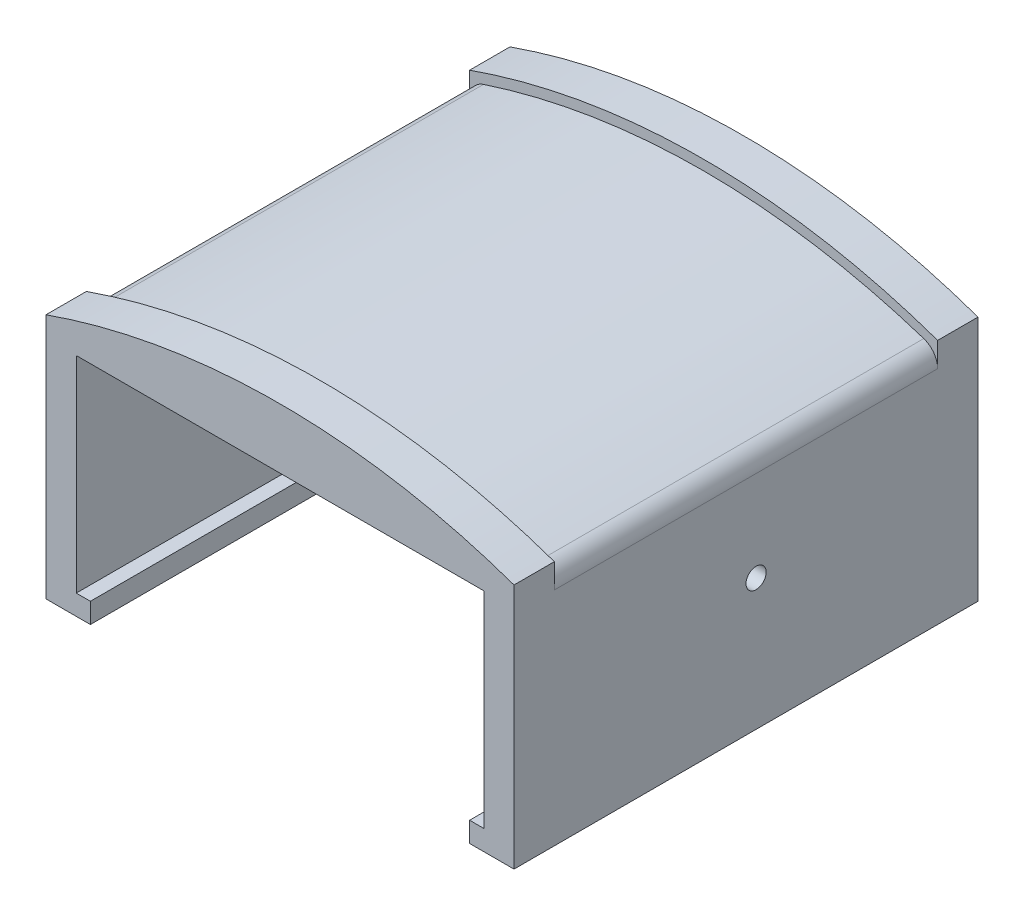
ISO-10303-21;
HEADER;
FILE_DESCRIPTION(('STEP AP214'),'2;1');
FILE_NAME('part.step','',(''),(''),'','','');
FILE_SCHEMA(('AUTOMOTIVE_DESIGN { 1 0 10303 214 1 1 1 1 }'));
ENDSEC;
DATA;
#1=APPLICATION_CONTEXT('core data for automotive mechanical design processes');
#2=APPLICATION_PROTOCOL_DEFINITION('international standard','automotive_design',2000,#1);
#3=PRODUCT_CONTEXT('',#1,'mechanical');
#4=PRODUCT('Part','Part','',(#3));
#5=PRODUCT_RELATED_PRODUCT_CATEGORY('part','',(#4));
#6=PRODUCT_DEFINITION_FORMATION('','',#4);
#7=PRODUCT_DEFINITION_CONTEXT('part definition',#1,'design');
#8=PRODUCT_DEFINITION('design','',#6,#7);
#9=PRODUCT_DEFINITION_SHAPE('','',#8);
#10=(LENGTH_UNIT() NAMED_UNIT(*) SI_UNIT(.MILLI.,.METRE.));
#11=(NAMED_UNIT(*) PLANE_ANGLE_UNIT() SI_UNIT($,.RADIAN.));
#12=(NAMED_UNIT(*) SI_UNIT($,.STERADIAN.) SOLID_ANGLE_UNIT());
#13=UNCERTAINTY_MEASURE_WITH_UNIT(LENGTH_MEASURE(1.E-05),#10,'distance_accuracy_value','');
#14=(GEOMETRIC_REPRESENTATION_CONTEXT(3) GLOBAL_UNCERTAINTY_ASSIGNED_CONTEXT((#13)) GLOBAL_UNIT_ASSIGNED_CONTEXT((#10,
#11,#12)) REPRESENTATION_CONTEXT('',''));
#15=CARTESIAN_POINT('',(0.,0.,0.));
#16=DIRECTION('',(0.,0.,1.));
#17=DIRECTION('',(1.,0.,0.));
#18=AXIS2_PLACEMENT_3D('',#15,#16,#17);
#19=CARTESIAN_POINT('',(0.,-82.6053998738605,25.4));
#20=DIRECTION('',(0.,0.,-1.));
#21=DIRECTION('',(-1.,0.,0.));
#22=AXIS2_PLACEMENT_3D('',#19,#20,#21);
#23=CYLINDRICAL_SURFACE('',#22,88.9);
#24=CARTESIAN_POINT('',(0.,-82.6053998738605,25.4));
#25=DIRECTION('',(0.,0.,1.));
#26=DIRECTION('',(-1.,0.,0.));
#27=AXIS2_PLACEMENT_3D('',#24,#25,#26);
#28=CIRCLE('',#27,88.9);
#29=CARTESIAN_POINT('',(27.7158823529412,1.86376530135549,25.4));
#30=VERTEX_POINT('',#29);
#31=CARTESIAN_POINT('',(-27.7158823529412,1.86376530135549,25.4));
#32=VERTEX_POINT('',#31);
#33=EDGE_CURVE('E267',#30,#32,#28,.T.);
#34=ORIENTED_EDGE('',*,*,#33,.F.);
#35=DIRECTION('',(0.,0.,-1.));
#36=VECTOR('',#35,1.);
#37=CARTESIAN_POINT('',(27.7158823529412,1.8637653013555,25.4));
#38=LINE('',#37,#36);
#39=CARTESIAN_POINT('',(27.7158823529412,1.86376530135549,-22.86));
#40=VERTEX_POINT('',#39);
#41=EDGE_CURVE('E292',#30,#40,#38,.T.);
#42=ORIENTED_EDGE('',*,*,#41,.T.);
#43=CARTESIAN_POINT('',(0.,-82.6053998738605,-22.86));
#44=DIRECTION('',(0.,0.,-1.));
#45=DIRECTION('',(-1.,0.,0.));
#46=AXIS2_PLACEMENT_3D('',#43,#44,#45);
#47=CIRCLE('',#46,88.9);
#48=CARTESIAN_POINT('',(-27.7158823529412,1.86376530135549,-22.86));
#49=VERTEX_POINT('',#48);
#50=EDGE_CURVE('E179',#49,#40,#47,.T.);
#51=ORIENTED_EDGE('',*,*,#50,.F.);
#52=DIRECTION('',(0.,0.,-1.));
#53=VECTOR('',#52,1.);
#54=CARTESIAN_POINT('',(-27.7158823529412,1.8637653013555,25.4));
#55=LINE('',#54,#53);
#56=EDGE_CURVE('E290',#49,#32,#55,.F.);
#57=ORIENTED_EDGE('',*,*,#56,.T.);
#58=EDGE_LOOP('',(#34,#42,#51,#57));
#59=FACE_BOUND('',#58,.T.);
#60=ADVANCED_FACE('F35',(#59),#23,.T.);
#61=CARTESIAN_POINT('',(-25.654,0.,25.4));
#62=DIRECTION('',(-1.,0.,0.));
#63=DIRECTION('',(0.,-1.,0.));
#64=AXIS2_PLACEMENT_3D('',#61,#62,#63);
#65=PLANE('',#64);
#66=CARTESIAN_POINT('',(-25.654,-11.938,0.));
#67=DIRECTION('',(-1.,0.,0.));
#68=DIRECTION('',(0.,-1.,0.));
#69=AXIS2_PLACEMENT_3D('',#66,#67,#68);
#70=CIRCLE('',#69,1.27);
#71=CARTESIAN_POINT('',(-25.654,-13.208,0.));
#72=VERTEX_POINT('',#71);
#73=EDGE_CURVE('E192',#72,#72,#70,.T.);
#74=ORIENTED_EDGE('',*,*,#73,.T.);
#75=EDGE_LOOP('',(#74));
#76=FACE_BOUND('',#75,.T.);
#77=DIRECTION('',(0.,1.,0.));
#78=VECTOR('',#77,1.);
#79=CARTESIAN_POINT('',(-25.654,-25.908,-27.94));
#80=LINE('',#79,#78);
#81=CARTESIAN_POINT('',(-25.654,-25.908,-27.94));
#82=VERTEX_POINT('',#81);
#83=CARTESIAN_POINT('',(-25.654,0.,-27.94));
#84=VERTEX_POINT('',#83);
#85=EDGE_CURVE('E191',#82,#84,#80,.T.);
#86=ORIENTED_EDGE('',*,*,#85,.T.);
#87=DIRECTION('',(0.,0.,-1.));
#88=VECTOR('',#87,1.);
#89=CARTESIAN_POINT('',(-25.654,0.,25.4));
#90=LINE('',#89,#88);
#91=CARTESIAN_POINT('',(-25.654,0.,30.48));
#92=VERTEX_POINT('',#91);
#93=EDGE_CURVE('E288',#92,#84,#90,.T.);
#94=ORIENTED_EDGE('',*,*,#93,.F.);
#95=DIRECTION('',(0.,1.,0.));
#96=VECTOR('',#95,1.);
#97=CARTESIAN_POINT('',(-25.654,-25.908,30.48));
#98=LINE('',#97,#96);
#99=CARTESIAN_POINT('',(-25.654,-25.908,30.48));
#100=VERTEX_POINT('',#99);
#101=EDGE_CURVE('E227',#100,#92,#98,.T.);
#102=ORIENTED_EDGE('',*,*,#101,.F.);
#103=DIRECTION('',(0.,0.,-1.));
#104=VECTOR('',#103,1.);
#105=CARTESIAN_POINT('',(-25.654,-25.908,25.4));
#106=LINE('',#105,#104);
#107=EDGE_CURVE('E270',#100,#82,#106,.T.);
#108=ORIENTED_EDGE('',*,*,#107,.T.);
#109=EDGE_LOOP('',(#86,#94,#102,#108));
#110=FACE_BOUND('',#109,.T.);
#111=ADVANCED_FACE('F363',(#76,#110),#65,.F.);
#112=CARTESIAN_POINT('',(-25.654,0.,25.4));
#113=DIRECTION('',(0.,1.,0.));
#114=DIRECTION('',(-1.,0.,0.));
#115=AXIS2_PLACEMENT_3D('',#112,#113,#114);
#116=PLANE('',#115);
#117=DIRECTION('',(1.,0.,0.));
#118=VECTOR('',#117,1.);
#119=CARTESIAN_POINT('',(-25.654,0.,-27.94));
#120=LINE('',#119,#118);
#121=CARTESIAN_POINT('',(25.654,0.,-27.94));
#122=VERTEX_POINT('',#121);
#123=EDGE_CURVE('E195',#84,#122,#120,.T.);
#124=ORIENTED_EDGE('',*,*,#123,.T.);
#125=DIRECTION('',(0.,0.,-1.));
#126=VECTOR('',#125,1.);
#127=CARTESIAN_POINT('',(25.654,0.,25.4));
#128=LINE('',#127,#126);
#129=CARTESIAN_POINT('',(25.654,0.,30.48));
#130=VERTEX_POINT('',#129);
#131=EDGE_CURVE('E286',#130,#122,#128,.T.);
#132=ORIENTED_EDGE('',*,*,#131,.F.);
#133=DIRECTION('',(1.,0.,0.));
#134=VECTOR('',#133,1.);
#135=CARTESIAN_POINT('',(-25.654,0.,30.48));
#136=LINE('',#135,#134);
#137=EDGE_CURVE('E230',#92,#130,#136,.T.);
#138=ORIENTED_EDGE('',*,*,#137,.F.);
#139=ORIENTED_EDGE('',*,*,#93,.T.);
#140=EDGE_LOOP('',(#124,#132,#138,#139));
#141=FACE_BOUND('',#140,.T.);
#142=ADVANCED_FACE('F350',(#141),#116,.F.);
#143=CARTESIAN_POINT('',(25.654,0.,25.4));
#144=DIRECTION('',(1.,0.,0.));
#145=DIRECTION('',(0.,1.,0.));
#146=AXIS2_PLACEMENT_3D('',#143,#144,#145);
#147=PLANE('',#146);
#148=CARTESIAN_POINT('',(25.654,-11.938,0.));
#149=DIRECTION('',(1.,0.,0.));
#150=DIRECTION('',(0.,1.,0.));
#151=AXIS2_PLACEMENT_3D('',#148,#149,#150);
#152=CIRCLE('',#151,1.27);
#153=CARTESIAN_POINT('',(25.654,-10.668,0.));
#154=VERTEX_POINT('',#153);
#155=EDGE_CURVE('E418',#154,#154,#152,.T.);
#156=ORIENTED_EDGE('',*,*,#155,.T.);
#157=EDGE_LOOP('',(#156));
#158=FACE_BOUND('',#157,.T.);
#159=DIRECTION('',(0.,-1.,0.));
#160=VECTOR('',#159,1.);
#161=CARTESIAN_POINT('',(25.654,0.,-27.94));
#162=LINE('',#161,#160);
#163=CARTESIAN_POINT('',(25.654,-25.908,-27.94));
#164=VERTEX_POINT('',#163);
#165=EDGE_CURVE('E198',#122,#164,#162,.T.);
#166=ORIENTED_EDGE('',*,*,#165,.T.);
#167=DIRECTION('',(0.,0.,-1.));
#168=VECTOR('',#167,1.);
#169=CARTESIAN_POINT('',(25.654,-25.908,25.4));
#170=LINE('',#169,#168);
#171=CARTESIAN_POINT('',(25.654,-25.908,30.48));
#172=VERTEX_POINT('',#171);
#173=EDGE_CURVE('E284',#172,#164,#170,.T.);
#174=ORIENTED_EDGE('',*,*,#173,.F.);
#175=DIRECTION('',(0.,-1.,0.));
#176=VECTOR('',#175,1.);
#177=CARTESIAN_POINT('',(25.654,0.,30.48));
#178=LINE('',#177,#176);
#179=EDGE_CURVE('E233',#130,#172,#178,.T.);
#180=ORIENTED_EDGE('',*,*,#179,.F.);
#181=ORIENTED_EDGE('',*,*,#131,.T.);
#182=EDGE_LOOP('',(#166,#174,#180,#181));
#183=FACE_BOUND('',#182,.T.);
#184=ADVANCED_FACE('F354',(#158,#183),#147,.F.);
#185=CARTESIAN_POINT('',(25.654,-25.908,25.4));
#186=DIRECTION('',(0.,-1.,0.));
#187=DIRECTION('',(0.,0.,-1.));
#188=AXIS2_PLACEMENT_3D('',#185,#186,#187);
#189=PLANE('',#188);
#190=DIRECTION('',(-1.,0.,0.));
#191=VECTOR('',#190,1.);
#192=CARTESIAN_POINT('',(25.654,-25.908,-27.94));
#193=LINE('',#192,#191);
#194=CARTESIAN_POINT('',(23.876,-25.908,-27.94));
#195=VERTEX_POINT('',#194);
#196=EDGE_CURVE('E201',#164,#195,#193,.T.);
#197=ORIENTED_EDGE('',*,*,#196,.T.);
#198=DIRECTION('',(0.,0.,-1.));
#199=VECTOR('',#198,1.);
#200=CARTESIAN_POINT('',(23.876,-25.908,25.4));
#201=LINE('',#200,#199);
#202=CARTESIAN_POINT('',(23.876,-25.908,30.48));
#203=VERTEX_POINT('',#202);
#204=EDGE_CURVE('E282',#203,#195,#201,.T.);
#205=ORIENTED_EDGE('',*,*,#204,.F.);
#206=DIRECTION('',(-1.,0.,0.));
#207=VECTOR('',#206,1.);
#208=CARTESIAN_POINT('',(25.654,-25.908,30.48));
#209=LINE('',#208,#207);
#210=EDGE_CURVE('E236',#172,#203,#209,.T.);
#211=ORIENTED_EDGE('',*,*,#210,.F.);
#212=ORIENTED_EDGE('',*,*,#173,.T.);
#213=EDGE_LOOP('',(#197,#205,#211,#212));
#214=FACE_BOUND('',#213,.T.);
#215=ADVANCED_FACE('F359',(#214),#189,.F.);
#216=CARTESIAN_POINT('',(23.876,-25.908,25.4));
#217=DIRECTION('',(1.,0.,0.));
#218=DIRECTION('',(0.,0.,-1.));
#219=AXIS2_PLACEMENT_3D('',#216,#217,#218);
#220=PLANE('',#219);
#221=DIRECTION('',(0.,-1.,0.));
#222=VECTOR('',#221,1.);
#223=CARTESIAN_POINT('',(23.876,-25.908,-27.94));
#224=LINE('',#223,#222);
#225=CARTESIAN_POINT('',(23.876,-28.448,-27.94));
#226=VERTEX_POINT('',#225);
#227=EDGE_CURVE('E204',#195,#226,#224,.T.);
#228=ORIENTED_EDGE('',*,*,#227,.T.);
#229=DIRECTION('',(0.,0.,-1.));
#230=VECTOR('',#229,1.);
#231=CARTESIAN_POINT('',(23.876,-28.448,25.4));
#232=LINE('',#231,#230);
#233=CARTESIAN_POINT('',(23.876,-28.448,30.48));
#234=VERTEX_POINT('',#233);
#235=EDGE_CURVE('E280',#234,#226,#232,.T.);
#236=ORIENTED_EDGE('',*,*,#235,.F.);
#237=DIRECTION('',(0.,-1.,0.));
#238=VECTOR('',#237,1.);
#239=CARTESIAN_POINT('',(23.876,-25.908,30.48));
#240=LINE('',#239,#238);
#241=EDGE_CURVE('E239',#203,#234,#240,.T.);
#242=ORIENTED_EDGE('',*,*,#241,.F.);
#243=ORIENTED_EDGE('',*,*,#204,.T.);
#244=EDGE_LOOP('',(#228,#236,#242,#243));
#245=FACE_BOUND('',#244,.T.);
#246=ADVANCED_FACE('F361',(#245),#220,.F.);
#247=CARTESIAN_POINT('',(23.876,-28.448,25.4));
#248=DIRECTION('',(0.,1.,0.));
#249=DIRECTION('',(-1.,0.,0.));
#250=AXIS2_PLACEMENT_3D('',#247,#248,#249);
#251=PLANE('',#250);
#252=DIRECTION('',(1.,0.,0.));
#253=VECTOR('',#252,1.);
#254=CARTESIAN_POINT('',(23.876,-28.448,-27.94));
#255=LINE('',#254,#253);
#256=CARTESIAN_POINT('',(29.464,-28.448,-27.94));
#257=VERTEX_POINT('',#256);
#258=EDGE_CURVE('E207',#226,#257,#255,.T.);
#259=ORIENTED_EDGE('',*,*,#258,.T.);
#260=DIRECTION('',(0.,0.,-1.));
#261=VECTOR('',#260,1.);
#262=CARTESIAN_POINT('',(29.464,-28.448,25.4));
#263=LINE('',#262,#261);
#264=CARTESIAN_POINT('',(29.464,-28.448,30.48));
#265=VERTEX_POINT('',#264);
#266=EDGE_CURVE('E278',#265,#257,#263,.T.);
#267=ORIENTED_EDGE('',*,*,#266,.F.);
#268=DIRECTION('',(1.,0.,0.));
#269=VECTOR('',#268,1.);
#270=CARTESIAN_POINT('',(23.876,-28.448,30.48));
#271=LINE('',#270,#269);
#272=EDGE_CURVE('E242',#234,#265,#271,.T.);
#273=ORIENTED_EDGE('',*,*,#272,.F.);
#274=ORIENTED_EDGE('',*,*,#235,.T.);
#275=EDGE_LOOP('',(#259,#267,#273,#274));
#276=FACE_BOUND('',#275,.T.);
#277=ADVANCED_FACE('F328',(#276),#251,.F.);
#278=CARTESIAN_POINT('',(29.464,-28.448,25.4));
#279=DIRECTION('',(-1.,0.,0.));
#280=DIRECTION('',(0.,-1.,0.));
#281=AXIS2_PLACEMENT_3D('',#278,#279,#280);
#282=PLANE('',#281);
#283=CARTESIAN_POINT('',(29.464,-11.938,0.));
#284=DIRECTION('',(-1.,0.,0.));
#285=DIRECTION('',(0.,0.,1.));
#286=AXIS2_PLACEMENT_3D('',#283,#284,#285);
#287=CIRCLE('',#286,1.27);
#288=CARTESIAN_POINT('',(29.464,-11.938,1.27));
#289=VERTEX_POINT('',#288);
#290=EDGE_CURVE('E420',#289,#289,#287,.T.);
#291=ORIENTED_EDGE('',*,*,#290,.T.);
#292=EDGE_LOOP('',(#291));
#293=FACE_BOUND('',#292,.T.);
#294=DIRECTION('',(0.,1.,0.));
#295=VECTOR('',#294,1.);
#296=CARTESIAN_POINT('',(29.464,-28.448,-22.86));
#297=LINE('',#296,#295);
#298=CARTESIAN_POINT('',(29.464,-0.549639417936399,-22.86));
#299=VERTEX_POINT('',#298);
#300=CARTESIAN_POINT('',(29.464,2.54,-22.86));
#301=VERTEX_POINT('',#300);
#302=EDGE_CURVE('E159',#299,#301,#297,.T.);
#303=ORIENTED_EDGE('',*,*,#302,.F.);
#304=DIRECTION('',(0.,0.,-1.));
#305=VECTOR('',#304,1.);
#306=CARTESIAN_POINT('',(29.464,-0.549639417936398,25.4));
#307=LINE('',#306,#305);
#308=CARTESIAN_POINT('',(29.464,-0.549639417936405,25.4));
#309=VERTEX_POINT('',#308);
#310=EDGE_CURVE('E295',#299,#309,#307,.F.);
#311=ORIENTED_EDGE('',*,*,#310,.T.);
#312=DIRECTION('',(0.,1.,0.));
#313=VECTOR('',#312,1.);
#314=CARTESIAN_POINT('',(29.464,-28.448,25.4));
#315=LINE('',#314,#313);
#316=CARTESIAN_POINT('',(29.464,2.54,25.4));
#317=VERTEX_POINT('',#316);
#318=EDGE_CURVE('E223',#309,#317,#315,.T.);
#319=ORIENTED_EDGE('',*,*,#318,.T.);
#320=DIRECTION('',(0.,0.,-1.));
#321=VECTOR('',#320,1.);
#322=CARTESIAN_POINT('',(29.464,2.54,30.48));
#323=LINE('',#322,#321);
#324=CARTESIAN_POINT('',(29.464,2.54,30.48));
#325=VERTEX_POINT('',#324);
#326=EDGE_CURVE('E264',#325,#317,#323,.T.);
#327=ORIENTED_EDGE('',*,*,#326,.F.);
#328=DIRECTION('',(0.,1.,0.));
#329=VECTOR('',#328,1.);
#330=CARTESIAN_POINT('',(29.464,-28.448,30.48));
#331=LINE('',#330,#329);
#332=EDGE_CURVE('E245',#265,#325,#331,.T.);
#333=ORIENTED_EDGE('',*,*,#332,.F.);
#334=ORIENTED_EDGE('',*,*,#266,.T.);
#335=DIRECTION('',(0.,1.,0.));
#336=VECTOR('',#335,1.);
#337=CARTESIAN_POINT('',(29.464,-28.448,-27.94));
#338=LINE('',#337,#336);
#339=CARTESIAN_POINT('',(29.464,2.54,-27.94));
#340=VERTEX_POINT('',#339);
#341=EDGE_CURVE('E176',#257,#340,#338,.T.);
#342=ORIENTED_EDGE('',*,*,#341,.T.);
#343=DIRECTION('',(0.,0.,-1.));
#344=VECTOR('',#343,1.);
#345=CARTESIAN_POINT('',(29.464,2.54,-22.86));
#346=LINE('',#345,#344);
#347=EDGE_CURVE('E173',#301,#340,#346,.T.);
#348=ORIENTED_EDGE('',*,*,#347,.F.);
#349=EDGE_LOOP('',(#303,#311,#319,#327,#333,#334,#342,#348));
#350=FACE_BOUND('',#349,.T.);
#351=ADVANCED_FACE('F174',(#293,#350),#282,.F.);
#352=CARTESIAN_POINT('',(-29.464,-28.448,25.4));
#353=DIRECTION('',(1.,0.,0.));
#354=DIRECTION('',(0.,0.,-1.));
#355=AXIS2_PLACEMENT_3D('',#352,#353,#354);
#356=PLANE('',#355);
#357=CARTESIAN_POINT('',(-29.464,-11.938,0.));
#358=DIRECTION('',(-1.,0.,0.));
#359=DIRECTION('',(0.,0.,1.));
#360=AXIS2_PLACEMENT_3D('',#357,#358,#359);
#361=CIRCLE('',#360,1.27);
#362=CARTESIAN_POINT('',(-29.464,-11.938,1.27));
#363=VERTEX_POINT('',#362);
#364=EDGE_CURVE('E423',#363,#363,#361,.T.);
#365=ORIENTED_EDGE('',*,*,#364,.F.);
#366=EDGE_LOOP('',(#365));
#367=FACE_BOUND('',#366,.T.);
#368=DIRECTION('',(0.,0.,-1.));
#369=VECTOR('',#368,1.);
#370=CARTESIAN_POINT('',(-29.464,-0.549639417936398,25.4));
#371=LINE('',#370,#369);
#372=CARTESIAN_POINT('',(-29.464,-0.549639417936405,25.4));
#373=VERTEX_POINT('',#372);
#374=CARTESIAN_POINT('',(-29.464,-0.549639417936398,-22.86));
#375=VERTEX_POINT('',#374);
#376=EDGE_CURVE('E297',#373,#375,#371,.T.);
#377=ORIENTED_EDGE('',*,*,#376,.T.);
#378=DIRECTION('',(0.,-1.,0.));
#379=VECTOR('',#378,1.);
#380=CARTESIAN_POINT('',(-29.464,-28.448,-22.86));
#381=LINE('',#380,#379);
#382=CARTESIAN_POINT('',(-29.464,2.53999999999999,-22.86));
#383=VERTEX_POINT('',#382);
#384=EDGE_CURVE('E50',#383,#375,#381,.T.);
#385=ORIENTED_EDGE('',*,*,#384,.F.);
#386=DIRECTION('',(0.,0.,-1.));
#387=VECTOR('',#386,1.);
#388=CARTESIAN_POINT('',(-29.464,2.53999999999999,-22.86));
#389=LINE('',#388,#387);
#390=CARTESIAN_POINT('',(-29.464,2.53999999999999,-27.94));
#391=VERTEX_POINT('',#390);
#392=EDGE_CURVE('E180',#383,#391,#389,.T.);
#393=ORIENTED_EDGE('',*,*,#392,.T.);
#394=DIRECTION('',(0.,-1.,0.));
#395=VECTOR('',#394,1.);
#396=CARTESIAN_POINT('',(-29.464,-28.448,-27.94));
#397=LINE('',#396,#395);
#398=CARTESIAN_POINT('',(-29.464,-28.448,-27.94));
#399=VERTEX_POINT('',#398);
#400=EDGE_CURVE('E213',#391,#399,#397,.T.);
#401=ORIENTED_EDGE('',*,*,#400,.T.);
#402=DIRECTION('',(0.,0.,-1.));
#403=VECTOR('',#402,1.);
#404=CARTESIAN_POINT('',(-29.464,-28.448,25.4));
#405=LINE('',#404,#403);
#406=CARTESIAN_POINT('',(-29.464,-28.448,30.48));
#407=VERTEX_POINT('',#406);
#408=EDGE_CURVE('E276',#407,#399,#405,.T.);
#409=ORIENTED_EDGE('',*,*,#408,.F.);
#410=DIRECTION('',(0.,-1.,0.));
#411=VECTOR('',#410,1.);
#412=CARTESIAN_POINT('',(-29.464,-28.448,30.48));
#413=LINE('',#412,#411);
#414=CARTESIAN_POINT('',(-29.464,2.53999999999999,30.48));
#415=VERTEX_POINT('',#414);
#416=EDGE_CURVE('E249',#415,#407,#413,.T.);
#417=ORIENTED_EDGE('',*,*,#416,.F.);
#418=DIRECTION('',(0.,0.,-1.));
#419=VECTOR('',#418,1.);
#420=CARTESIAN_POINT('',(-29.464,2.53999999999999,30.48));
#421=LINE('',#420,#419);
#422=CARTESIAN_POINT('',(-29.464,2.53999999999999,25.4));
#423=VERTEX_POINT('',#422);
#424=EDGE_CURVE('E258',#415,#423,#421,.T.);
#425=ORIENTED_EDGE('',*,*,#424,.T.);
#426=DIRECTION('',(0.,-1.,0.));
#427=VECTOR('',#426,1.);
#428=CARTESIAN_POINT('',(-29.464,-28.448,25.4));
#429=LINE('',#428,#427);
#430=EDGE_CURVE('E58',#423,#373,#429,.T.);
#431=ORIENTED_EDGE('',*,*,#430,.T.);
#432=EDGE_LOOP('',(#377,#385,#393,#401,#409,#417,#425,#431));
#433=FACE_BOUND('',#432,.T.);
#434=ADVANCED_FACE('F335',(#367,#433),#356,.F.);
#435=CARTESIAN_POINT('',(-23.876,-28.448,25.4));
#436=DIRECTION('',(0.,1.,0.));
#437=DIRECTION('',(0.,0.,1.));
#438=AXIS2_PLACEMENT_3D('',#435,#436,#437);
#439=PLANE('',#438);
#440=DIRECTION('',(1.,0.,0.));
#441=VECTOR('',#440,1.);
#442=CARTESIAN_POINT('',(-29.464,-28.448,-27.94));
#443=LINE('',#442,#441);
#444=CARTESIAN_POINT('',(-23.876,-28.448,-27.94));
#445=VERTEX_POINT('',#444);
#446=EDGE_CURVE('E216',#399,#445,#443,.T.);
#447=ORIENTED_EDGE('',*,*,#446,.T.);
#448=DIRECTION('',(0.,0.,-1.));
#449=VECTOR('',#448,1.);
#450=CARTESIAN_POINT('',(-23.876,-28.448,25.4));
#451=LINE('',#450,#449);
#452=CARTESIAN_POINT('',(-23.876,-28.448,30.48));
#453=VERTEX_POINT('',#452);
#454=EDGE_CURVE('E274',#453,#445,#451,.T.);
#455=ORIENTED_EDGE('',*,*,#454,.F.);
#456=DIRECTION('',(1.,0.,0.));
#457=VECTOR('',#456,1.);
#458=CARTESIAN_POINT('',(-29.464,-28.448,30.48));
#459=LINE('',#458,#457);
#460=EDGE_CURVE('E252',#407,#453,#459,.T.);
#461=ORIENTED_EDGE('',*,*,#460,.F.);
#462=ORIENTED_EDGE('',*,*,#408,.T.);
#463=EDGE_LOOP('',(#447,#455,#461,#462));
#464=FACE_BOUND('',#463,.T.);
#465=ADVANCED_FACE('F338',(#464),#439,.F.);
#466=CARTESIAN_POINT('',(-23.876,-25.908,25.4));
#467=DIRECTION('',(-1.,0.,0.));
#468=DIRECTION('',(0.,-1.,0.));
#469=AXIS2_PLACEMENT_3D('',#466,#467,#468);
#470=PLANE('',#469);
#471=DIRECTION('',(0.,1.,0.));
#472=VECTOR('',#471,1.);
#473=CARTESIAN_POINT('',(-23.876,-28.448,-27.94));
#474=LINE('',#473,#472);
#475=CARTESIAN_POINT('',(-23.876,-25.908,-27.94));
#476=VERTEX_POINT('',#475);
#477=EDGE_CURVE('E170',#445,#476,#474,.T.);
#478=ORIENTED_EDGE('',*,*,#477,.T.);
#479=DIRECTION('',(0.,0.,-1.));
#480=VECTOR('',#479,1.);
#481=CARTESIAN_POINT('',(-23.876,-25.908,25.4));
#482=LINE('',#481,#480);
#483=CARTESIAN_POINT('',(-23.876,-25.908,30.48));
#484=VERTEX_POINT('',#483);
#485=EDGE_CURVE('E272',#484,#476,#482,.T.);
#486=ORIENTED_EDGE('',*,*,#485,.F.);
#487=DIRECTION('',(0.,1.,0.));
#488=VECTOR('',#487,1.);
#489=CARTESIAN_POINT('',(-23.876,-28.448,30.48));
#490=LINE('',#489,#488);
#491=EDGE_CURVE('E255',#453,#484,#490,.T.);
#492=ORIENTED_EDGE('',*,*,#491,.F.);
#493=ORIENTED_EDGE('',*,*,#454,.T.);
#494=EDGE_LOOP('',(#478,#486,#492,#493));
#495=FACE_BOUND('',#494,.T.);
#496=ADVANCED_FACE('F342',(#495),#470,.F.);
#497=CARTESIAN_POINT('',(-25.654,-25.908,25.4));
#498=DIRECTION('',(0.,-1.,0.));
#499=DIRECTION('',(0.,0.,-1.));
#500=AXIS2_PLACEMENT_3D('',#497,#498,#499);
#501=PLANE('',#500);
#502=DIRECTION('',(-1.,0.,0.));
#503=VECTOR('',#502,1.);
#504=CARTESIAN_POINT('',(-23.876,-25.908,-27.94));
#505=LINE('',#504,#503);
#506=EDGE_CURVE('E188',#476,#82,#505,.T.);
#507=ORIENTED_EDGE('',*,*,#506,.T.);
#508=ORIENTED_EDGE('',*,*,#107,.F.);
#509=DIRECTION('',(-1.,0.,0.));
#510=VECTOR('',#509,1.);
#511=CARTESIAN_POINT('',(-23.876,-25.908,30.48));
#512=LINE('',#511,#510);
#513=EDGE_CURVE('E224',#484,#100,#512,.T.);
#514=ORIENTED_EDGE('',*,*,#513,.F.);
#515=ORIENTED_EDGE('',*,*,#485,.T.);
#516=EDGE_LOOP('',(#507,#508,#514,#515));
#517=FACE_BOUND('',#516,.T.);
#518=ADVANCED_FACE('F344',(#517),#501,.F.);
#519=CARTESIAN_POINT('',(0.,-81.3353998738605,30.48));
#520=DIRECTION('',(0.,0.,-1.));
#521=DIRECTION('',(-1.,0.,0.));
#522=AXIS2_PLACEMENT_3D('',#519,#520,#521);
#523=CYLINDRICAL_SURFACE('',#522,88.9);
#524=CARTESIAN_POINT('',(0.,-81.3353998738605,25.4));
#525=DIRECTION('',(0.,0.,1.));
#526=DIRECTION('',(-1.,0.,0.));
#527=AXIS2_PLACEMENT_3D('',#524,#525,#526);
#528=CIRCLE('',#527,88.9);
#529=EDGE_CURVE('E260',#317,#423,#528,.T.);
#530=ORIENTED_EDGE('',*,*,#529,.T.);
#531=ORIENTED_EDGE('',*,*,#424,.F.);
#532=CARTESIAN_POINT('',(0.,-81.3353998738605,30.48));
#533=DIRECTION('',(0.,0.,1.));
#534=DIRECTION('',(-1.,0.,0.));
#535=AXIS2_PLACEMENT_3D('',#532,#533,#534);
#536=CIRCLE('',#535,88.9);
#537=EDGE_CURVE('E247',#325,#415,#536,.T.);
#538=ORIENTED_EDGE('',*,*,#537,.F.);
#539=ORIENTED_EDGE('',*,*,#326,.T.);
#540=EDGE_LOOP('',(#530,#531,#538,#539));
#541=FACE_BOUND('',#540,.T.);
#542=ADVANCED_FACE('F319',(#541),#523,.T.);
#543=CARTESIAN_POINT('',(0.,-81.3353998738605,30.48));
#544=DIRECTION('',(0.,0.,-1.));
#545=DIRECTION('',(-1.,0.,0.));
#546=AXIS2_PLACEMENT_3D('',#543,#544,#545);
#547=PLANE('',#546);
#548=ORIENTED_EDGE('',*,*,#513,.T.);
#549=ORIENTED_EDGE('',*,*,#101,.T.);
#550=ORIENTED_EDGE('',*,*,#137,.T.);
#551=ORIENTED_EDGE('',*,*,#179,.T.);
#552=ORIENTED_EDGE('',*,*,#210,.T.);
#553=ORIENTED_EDGE('',*,*,#241,.T.);
#554=ORIENTED_EDGE('',*,*,#272,.T.);
#555=ORIENTED_EDGE('',*,*,#332,.T.);
#556=ORIENTED_EDGE('',*,*,#537,.T.);
#557=ORIENTED_EDGE('',*,*,#416,.T.);
#558=ORIENTED_EDGE('',*,*,#460,.T.);
#559=ORIENTED_EDGE('',*,*,#491,.T.);
#560=EDGE_LOOP('',(#548,#549,#550,#551,#552,#553,#554,#555,#556,#557,#558,#559));
#561=FACE_BOUND('',#560,.T.);
#562=ADVANCED_FACE('F323',(#561),#547,.F.);
#563=CARTESIAN_POINT('',(0.,-81.3353998738605,25.4));
#564=DIRECTION('',(0.,0.,-1.));
#565=DIRECTION('',(-1.,0.,0.));
#566=AXIS2_PLACEMENT_3D('',#563,#564,#565);
#567=PLANE('',#566);
#568=ORIENTED_EDGE('',*,*,#318,.F.);
#569=CARTESIAN_POINT('',(26.924,-0.549639417936398,25.4));
#570=DIRECTION('',(0.,0.,-1.));
#571=DIRECTION('',(-1.,0.,0.));
#572=AXIS2_PLACEMENT_3D('',#569,#570,#571);
#573=CIRCLE('',#572,2.54);
#574=EDGE_CURVE('E300',#309,#30,#573,.F.);
#575=ORIENTED_EDGE('',*,*,#574,.T.);
#576=ORIENTED_EDGE('',*,*,#33,.T.);
#577=CARTESIAN_POINT('',(-26.924,-0.549639417936398,25.4));
#578=DIRECTION('',(0.,0.,-1.));
#579=DIRECTION('',(-1.,0.,0.));
#580=AXIS2_PLACEMENT_3D('',#577,#578,#579);
#581=CIRCLE('',#580,2.54);
#582=EDGE_CURVE('E11',#32,#373,#581,.F.);
#583=ORIENTED_EDGE('',*,*,#582,.T.);
#584=ORIENTED_EDGE('',*,*,#430,.F.);
#585=ORIENTED_EDGE('',*,*,#529,.F.);
#586=EDGE_LOOP('',(#568,#575,#576,#583,#584,#585));
#587=FACE_BOUND('',#586,.T.);
#588=ADVANCED_FACE('F310',(#587),#567,.T.);
#589=CARTESIAN_POINT('',(0.,-81.3353998738605,-22.86));
#590=DIRECTION('',(0.,0.,-1.));
#591=DIRECTION('',(-1.,0.,0.));
#592=AXIS2_PLACEMENT_3D('',#589,#590,#591);
#593=PLANE('',#592);
#594=ORIENTED_EDGE('',*,*,#384,.T.);
#595=CARTESIAN_POINT('',(-26.924,-0.549639417936398,-22.86));
#596=DIRECTION('',(0.,0.,-1.));
#597=DIRECTION('',(-1.,0.,0.));
#598=AXIS2_PLACEMENT_3D('',#595,#596,#597);
#599=CIRCLE('',#598,2.54);
#600=EDGE_CURVE('E43',#375,#49,#599,.T.);
#601=ORIENTED_EDGE('',*,*,#600,.T.);
#602=ORIENTED_EDGE('',*,*,#50,.T.);
#603=CARTESIAN_POINT('',(26.924,-0.549639417936398,-22.86));
#604=DIRECTION('',(0.,0.,-1.));
#605=DIRECTION('',(-1.,0.,0.));
#606=AXIS2_PLACEMENT_3D('',#603,#604,#605);
#607=CIRCLE('',#606,2.54);
#608=EDGE_CURVE('E166',#40,#299,#607,.T.);
#609=ORIENTED_EDGE('',*,*,#608,.T.);
#610=ORIENTED_EDGE('',*,*,#302,.T.);
#611=CARTESIAN_POINT('',(0.,-81.3353998738605,-22.86));
#612=DIRECTION('',(0.,0.,1.));
#613=DIRECTION('',(-1.,0.,0.));
#614=AXIS2_PLACEMENT_3D('',#611,#612,#613);
#615=CIRCLE('',#614,88.9);
#616=EDGE_CURVE('E163',#301,#383,#615,.T.);
#617=ORIENTED_EDGE('',*,*,#616,.T.);
#618=EDGE_LOOP('',(#594,#601,#602,#609,#610,#617));
#619=FACE_BOUND('',#618,.T.);
#620=ADVANCED_FACE('F161',(#619),#593,.F.);
#621=CARTESIAN_POINT('',(0.,-81.3353998738605,-22.86));
#622=DIRECTION('',(0.,0.,-1.));
#623=DIRECTION('',(-1.,0.,0.));
#624=AXIS2_PLACEMENT_3D('',#621,#622,#623);
#625=CYLINDRICAL_SURFACE('',#624,88.9);
#626=CARTESIAN_POINT('',(0.,-81.3353998738605,-27.94));
#627=DIRECTION('',(0.,0.,1.));
#628=DIRECTION('',(-1.,0.,0.));
#629=AXIS2_PLACEMENT_3D('',#626,#627,#628);
#630=CIRCLE('',#629,88.9);
#631=EDGE_CURVE('E211',#340,#391,#630,.T.);
#632=ORIENTED_EDGE('',*,*,#631,.T.);
#633=ORIENTED_EDGE('',*,*,#392,.F.);
#634=ORIENTED_EDGE('',*,*,#616,.F.);
#635=ORIENTED_EDGE('',*,*,#347,.T.);
#636=EDGE_LOOP('',(#632,#633,#634,#635));
#637=FACE_BOUND('',#636,.T.);
#638=ADVANCED_FACE('F182',(#637),#625,.T.);
#639=CARTESIAN_POINT('',(0.,-81.3353998738605,-27.94));
#640=DIRECTION('',(0.,0.,-1.));
#641=DIRECTION('',(-1.,0.,0.));
#642=AXIS2_PLACEMENT_3D('',#639,#640,#641);
#643=PLANE('',#642);
#644=ORIENTED_EDGE('',*,*,#506,.F.);
#645=ORIENTED_EDGE('',*,*,#477,.F.);
#646=ORIENTED_EDGE('',*,*,#446,.F.);
#647=ORIENTED_EDGE('',*,*,#400,.F.);
#648=ORIENTED_EDGE('',*,*,#631,.F.);
#649=ORIENTED_EDGE('',*,*,#341,.F.);
#650=ORIENTED_EDGE('',*,*,#258,.F.);
#651=ORIENTED_EDGE('',*,*,#227,.F.);
#652=ORIENTED_EDGE('',*,*,#196,.F.);
#653=ORIENTED_EDGE('',*,*,#165,.F.);
#654=ORIENTED_EDGE('',*,*,#123,.F.);
#655=ORIENTED_EDGE('',*,*,#85,.F.);
#656=EDGE_LOOP('',(#644,#645,#646,#647,#648,#649,#650,#651,#652,#653,#654,#655));
#657=FACE_BOUND('',#656,.T.);
#658=ADVANCED_FACE('F332',(#657),#643,.T.);
#659=CARTESIAN_POINT('',(26.924,-0.549639417936398,25.4));
#660=DIRECTION('',(0.,0.,-1.));
#661=DIRECTION('',(-1.,0.,0.));
#662=AXIS2_PLACEMENT_3D('',#659,#660,#661);
#663=CYLINDRICAL_SURFACE('',#662,2.54);
#664=ORIENTED_EDGE('',*,*,#574,.F.);
#665=ORIENTED_EDGE('',*,*,#310,.F.);
#666=ORIENTED_EDGE('',*,*,#608,.F.);
#667=ORIENTED_EDGE('',*,*,#41,.F.);
#668=EDGE_LOOP('',(#664,#665,#666,#667));
#669=FACE_BOUND('',#668,.T.);
#670=ADVANCED_FACE('F314',(#669),#663,.T.);
#671=CARTESIAN_POINT('',(-26.924,-0.549639417936398,25.4));
#672=DIRECTION('',(0.,0.,-1.));
#673=DIRECTION('',(-1.,0.,0.));
#674=AXIS2_PLACEMENT_3D('',#671,#672,#673);
#675=CYLINDRICAL_SURFACE('',#674,2.54);
#676=ORIENTED_EDGE('',*,*,#582,.F.);
#677=ORIENTED_EDGE('',*,*,#56,.F.);
#678=ORIENTED_EDGE('',*,*,#600,.F.);
#679=ORIENTED_EDGE('',*,*,#376,.F.);
#680=EDGE_LOOP('',(#676,#677,#678,#679));
#681=FACE_BOUND('',#680,.T.);
#682=ADVANCED_FACE('F37',(#681),#675,.T.);
#683=CARTESIAN_POINT('',(29.464,-11.938,0.));
#684=DIRECTION('',(-1.,0.,0.));
#685=DIRECTION('',(0.,0.,1.));
#686=AXIS2_PLACEMENT_3D('',#683,#684,#685);
#687=CYLINDRICAL_SURFACE('',#686,1.27);
#688=ORIENTED_EDGE('',*,*,#364,.T.);
#689=EDGE_LOOP('',(#688));
#690=FACE_BOUND('',#689,.T.);
#691=ORIENTED_EDGE('',*,*,#73,.F.);
#692=EDGE_LOOP('',(#691));
#693=FACE_BOUND('',#692,.T.);
#694=ADVANCED_FACE('F380',(#690,#693),#687,.F.);
#695=ORIENTED_EDGE('',*,*,#290,.F.);
#696=EDGE_LOOP('',(#695));
#697=FACE_BOUND('',#696,.T.);
#698=ORIENTED_EDGE('',*,*,#155,.F.);
#699=EDGE_LOOP('',(#698));
#700=FACE_BOUND('',#699,.T.);
#701=ADVANCED_FACE('F431',(#697,#700),#687,.F.);
#702=CLOSED_SHELL('',(#60,#111,#142,#184,#215,#246,#277,#351,#434,#465,#496,#518,#542,#562,#588,
#620,#638,#658,#670,#682,#694,#701));
#703=MANIFOLD_SOLID_BREP('B2',#702);
#704=ADVANCED_BREP_SHAPE_REPRESENTATION('',(#18,#703),#14);
#705=SHAPE_DEFINITION_REPRESENTATION(#9,#704);
ENDSEC;
END-ISO-10303-21;
